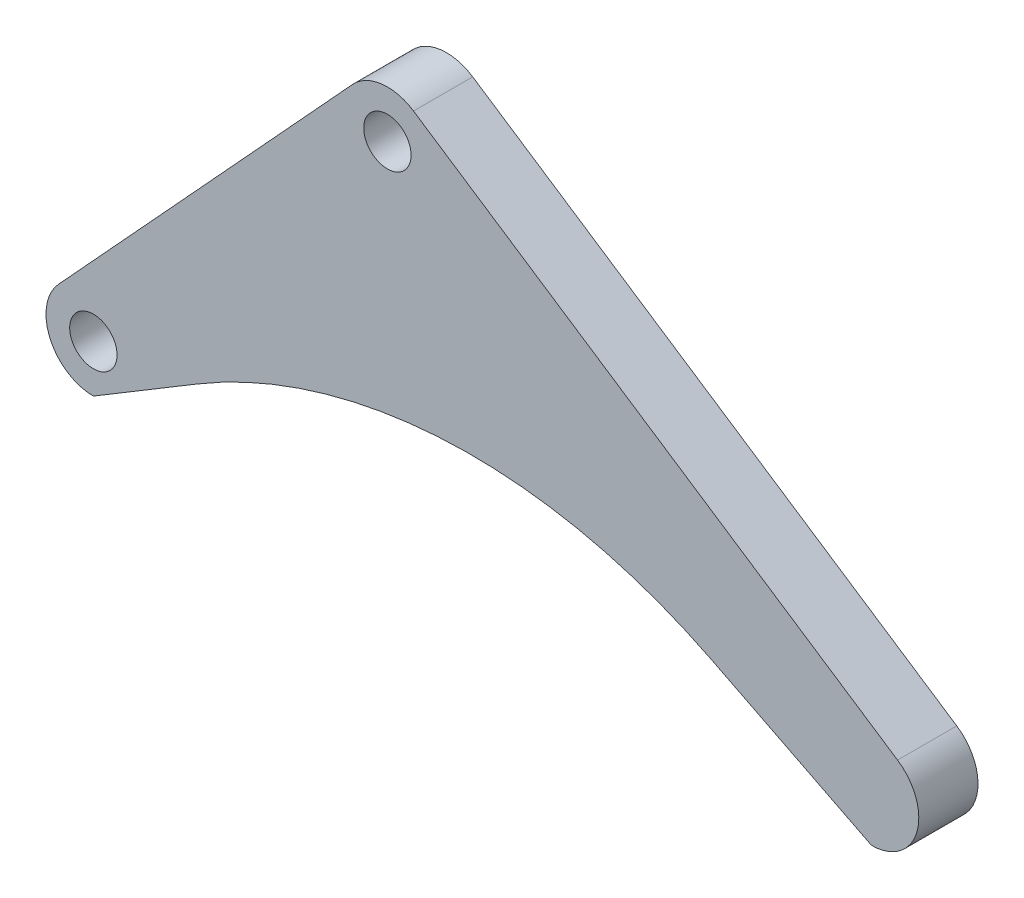
ISO-10303-21;
HEADER;
FILE_DESCRIPTION(('STEP AP214'),'2;1');
FILE_NAME('part.step','',(''),(''),'','','');
FILE_SCHEMA(('AUTOMOTIVE_DESIGN { 1 0 10303 214 1 1 1 1 }'));
ENDSEC;
DATA;
#1=APPLICATION_CONTEXT('core data for automotive mechanical design processes');
#2=APPLICATION_PROTOCOL_DEFINITION('international standard','automotive_design',2000,#1);
#3=PRODUCT_CONTEXT('',#1,'mechanical');
#4=PRODUCT('Part','Part','',(#3));
#5=PRODUCT_RELATED_PRODUCT_CATEGORY('part','',(#4));
#6=PRODUCT_DEFINITION_FORMATION('','',#4);
#7=PRODUCT_DEFINITION_CONTEXT('part definition',#1,'design');
#8=PRODUCT_DEFINITION('design','',#6,#7);
#9=PRODUCT_DEFINITION_SHAPE('','',#8);
#10=(LENGTH_UNIT() NAMED_UNIT(*) SI_UNIT(.MILLI.,.METRE.));
#11=(NAMED_UNIT(*) PLANE_ANGLE_UNIT() SI_UNIT($,.RADIAN.));
#12=(NAMED_UNIT(*) SI_UNIT($,.STERADIAN.) SOLID_ANGLE_UNIT());
#13=UNCERTAINTY_MEASURE_WITH_UNIT(LENGTH_MEASURE(1.E-05),#10,'distance_accuracy_value','');
#14=(GEOMETRIC_REPRESENTATION_CONTEXT(3) GLOBAL_UNCERTAINTY_ASSIGNED_CONTEXT((#13)) GLOBAL_UNIT_ASSIGNED_CONTEXT((#10,
#11,#12)) REPRESENTATION_CONTEXT('',''));
#15=CARTESIAN_POINT('',(0.,0.,0.));
#16=DIRECTION('',(0.,0.,1.));
#17=DIRECTION('',(1.,0.,0.));
#18=AXIS2_PLACEMENT_3D('',#15,#16,#17);
#19=CARTESIAN_POINT('',(65.7,0.,2.5));
#20=DIRECTION('',(0.,0.,1.));
#21=DIRECTION('',(1.,0.,0.));
#22=AXIS2_PLACEMENT_3D('',#19,#20,#21);
#23=PLANE('',#22);
#24=CARTESIAN_POINT('',(24.8278538812785,27.0271654386819,2.5));
#25=DIRECTION('',(0.,0.,1.));
#26=DIRECTION('',(1.,0.,0.));
#27=AXIS2_PLACEMENT_3D('',#24,#25,#26);
#28=CIRCLE('',#27,2.);
#29=CARTESIAN_POINT('',(26.8278538812785,27.0271654386819,2.5));
#30=VERTEX_POINT('',#29);
#31=EDGE_CURVE('E146',#30,#30,#28,.T.);
#32=ORIENTED_EDGE('',*,*,#31,.F.);
#33=EDGE_LOOP('',(#32));
#34=FACE_BOUND('',#33,.T.);
#35=CARTESIAN_POINT('',(65.7,0.,2.5));
#36=DIRECTION('',(0.,0.,1.));
#37=DIRECTION('',(1.,0.,0.));
#38=AXIS2_PLACEMENT_3D('',#35,#36,#37);
#39=CIRCLE('',#38,4.);
#40=CARTESIAN_POINT('',(65.6999999999998,-4.,2.5));
#41=VERTEX_POINT('',#40);
#42=CARTESIAN_POINT('',(67.9062992194841,3.33650172397736,2.5));
#43=VERTEX_POINT('',#42);
#44=EDGE_CURVE('E164',#41,#43,#39,.T.);
#45=ORIENTED_EDGE('',*,*,#44,.T.);
#46=DIRECTION('',(-0.834125430994315,0.551574804871059,0.));
#47=VECTOR('',#46,1.);
#48=CARTESIAN_POINT('',(27.0341531007628,30.3636671626592,2.5));
#49=LINE('',#48,#47);
#50=CARTESIAN_POINT('',(27.0341531007628,30.3636671626592,2.5));
#51=VERTEX_POINT('',#50);
#52=EDGE_CURVE('E100',#43,#51,#49,.T.);
#53=ORIENTED_EDGE('',*,*,#52,.T.);
#54=CARTESIAN_POINT('',(24.8278538812785,27.0271654386819,2.5));
#55=DIRECTION('',(0.,0.,1.));
#56=DIRECTION('',(-1.,0.,0.));
#57=AXIS2_PLACEMENT_3D('',#54,#55,#56);
#58=CIRCLE('',#57,4.);
#59=CARTESIAN_POINT('',(21.8821137789699,29.7331985592572,2.5));
#60=VERTEX_POINT('',#59);
#61=EDGE_CURVE('E185',#51,#60,#58,.T.);
#62=ORIENTED_EDGE('',*,*,#61,.T.);
#63=DIRECTION('',(-0.67650828014383,-0.736435025577164,0.));
#64=VECTOR('',#63,1.);
#65=CARTESIAN_POINT('',(-2.9457401023086,2.70603312057538,2.5));
#66=LINE('',#65,#64);
#67=CARTESIAN_POINT('',(-2.9457401023086,2.70603312057538,2.5));
#68=VERTEX_POINT('',#67);
#69=EDGE_CURVE('E199',#60,#68,#66,.T.);
#70=ORIENTED_EDGE('',*,*,#69,.T.);
#71=CARTESIAN_POINT('',(0.,0.,2.5));
#72=DIRECTION('',(0.,0.,1.));
#73=DIRECTION('',(-1.,0.,0.));
#74=AXIS2_PLACEMENT_3D('',#71,#72,#73);
#75=CIRCLE('',#74,4.);
#76=CARTESIAN_POINT('',(0.,-4.,2.5));
#77=VERTEX_POINT('',#76);
#78=EDGE_CURVE('E119',#68,#77,#75,.T.);
#79=ORIENTED_EDGE('',*,*,#78,.T.);
#80=DIRECTION('',(0.857031963470319,0.515263246884745,0.));
#81=VECTOR('',#80,1.);
#82=CARTESIAN_POINT('',(0.,-4.,2.5));
#83=LINE('',#82,#81);
#84=CARTESIAN_POINT('',(8.70031654707193,1.23078898343161,2.5));
#85=VERTEX_POINT('',#84);
#86=EDGE_CURVE('E113',#77,#85,#83,.T.);
#87=ORIENTED_EDGE('',*,*,#86,.T.);
#88=CARTESIAN_POINT('',(31.8871626568856,-37.3356493727326,2.5));
#89=DIRECTION('',(0.,0.,-1.));
#90=DIRECTION('',(1.,0.,0.));
#91=AXIS2_PLACEMENT_3D('',#88,#89,#90);
#92=CIRCLE('',#91,45.);
#93=CARTESIAN_POINT('',(52.1756530029727,2.8312170656234,2.5));
#94=VERTEX_POINT('',#93);
#95=EDGE_CURVE('E117',#85,#94,#92,.T.);
#96=ORIENTED_EDGE('',*,*,#95,.T.);
#97=DIRECTION('',(0.89259703196347,-0.450855341024152,0.));
#98=VECTOR('',#97,1.);
#99=CARTESIAN_POINT('',(52.1756530029727,2.8312170656234,2.5));
#100=LINE('',#99,#98);
#101=EDGE_CURVE('E57',#94,#41,#100,.T.);
#102=ORIENTED_EDGE('',*,*,#101,.T.);
#103=EDGE_LOOP('',(#45,#53,#62,#70,#79,#87,#96,#102));
#104=FACE_BOUND('',#103,.T.);
#105=CARTESIAN_POINT('',(0.,0.,2.5));
#106=DIRECTION('',(0.,0.,1.));
#107=DIRECTION('',(1.,0.,0.));
#108=AXIS2_PLACEMENT_3D('',#105,#106,#107);
#109=CIRCLE('',#108,2.);
#110=CARTESIAN_POINT('',(2.,0.,2.5));
#111=VERTEX_POINT('',#110);
#112=EDGE_CURVE('E213',#111,#111,#109,.T.);
#113=ORIENTED_EDGE('',*,*,#112,.F.);
#114=EDGE_LOOP('',(#113));
#115=FACE_BOUND('',#114,.T.);
#116=ADVANCED_FACE('F39',(#34,#104,#115),#23,.T.);
#117=CARTESIAN_POINT('',(65.7,0.,-2.5));
#118=DIRECTION('',(0.,0.,1.));
#119=DIRECTION('',(1.,0.,0.));
#120=AXIS2_PLACEMENT_3D('',#117,#118,#119);
#121=PLANE('',#120);
#122=CARTESIAN_POINT('',(65.7,0.,-2.5));
#123=DIRECTION('',(0.,0.,1.));
#124=DIRECTION('',(1.,0.,0.));
#125=AXIS2_PLACEMENT_3D('',#122,#123,#124);
#126=CIRCLE('',#125,4.);
#127=CARTESIAN_POINT('',(65.6999999999998,-4.,-2.5));
#128=VERTEX_POINT('',#127);
#129=CARTESIAN_POINT('',(67.9062992194841,3.33650172397736,-2.5));
#130=VERTEX_POINT('',#129);
#131=EDGE_CURVE('E141',#128,#130,#126,.T.);
#132=ORIENTED_EDGE('',*,*,#131,.F.);
#133=DIRECTION('',(0.89259703196347,-0.450855341024152,0.));
#134=VECTOR('',#133,1.);
#135=CARTESIAN_POINT('',(52.1756530029727,2.8312170656234,-2.5));
#136=LINE('',#135,#134);
#137=CARTESIAN_POINT('',(52.1756530029727,2.8312170656234,-2.5));
#138=VERTEX_POINT('',#137);
#139=EDGE_CURVE('E92',#138,#128,#136,.T.);
#140=ORIENTED_EDGE('',*,*,#139,.F.);
#141=CARTESIAN_POINT('',(31.8871626568856,-37.3356493727326,-2.5));
#142=DIRECTION('',(0.,0.,-1.));
#143=DIRECTION('',(1.,0.,0.));
#144=AXIS2_PLACEMENT_3D('',#141,#142,#143);
#145=CIRCLE('',#144,45.);
#146=CARTESIAN_POINT('',(8.70031654707193,1.23078898343161,-2.5));
#147=VERTEX_POINT('',#146);
#148=EDGE_CURVE('E86',#147,#138,#145,.T.);
#149=ORIENTED_EDGE('',*,*,#148,.F.);
#150=DIRECTION('',(0.857031963470319,0.515263246884745,0.));
#151=VECTOR('',#150,1.);
#152=CARTESIAN_POINT('',(0.,-4.,-2.5));
#153=LINE('',#152,#151);
#154=CARTESIAN_POINT('',(0.,-4.,-2.5));
#155=VERTEX_POINT('',#154);
#156=EDGE_CURVE('E128',#155,#147,#153,.T.);
#157=ORIENTED_EDGE('',*,*,#156,.F.);
#158=CARTESIAN_POINT('',(0.,0.,-2.5));
#159=DIRECTION('',(0.,0.,1.));
#160=DIRECTION('',(-1.,0.,0.));
#161=AXIS2_PLACEMENT_3D('',#158,#159,#160);
#162=CIRCLE('',#161,4.);
#163=CARTESIAN_POINT('',(-2.9457401023086,2.70603312057538,-2.5));
#164=VERTEX_POINT('',#163);
#165=EDGE_CURVE('E155',#164,#155,#162,.T.);
#166=ORIENTED_EDGE('',*,*,#165,.F.);
#167=DIRECTION('',(-0.67650828014383,-0.736435025577164,0.));
#168=VECTOR('',#167,1.);
#169=CARTESIAN_POINT('',(-2.9457401023086,2.70603312057538,-2.5));
#170=LINE('',#169,#168);
#171=CARTESIAN_POINT('',(21.8821137789699,29.7331985592572,-2.5));
#172=VERTEX_POINT('',#171);
#173=EDGE_CURVE('E152',#172,#164,#170,.T.);
#174=ORIENTED_EDGE('',*,*,#173,.F.);
#175=CARTESIAN_POINT('',(24.8278538812785,27.0271654386819,-2.5));
#176=DIRECTION('',(0.,0.,1.));
#177=DIRECTION('',(-1.,0.,0.));
#178=AXIS2_PLACEMENT_3D('',#175,#176,#177);
#179=CIRCLE('',#178,4.);
#180=CARTESIAN_POINT('',(27.0341531007628,30.3636671626592,-2.5));
#181=VERTEX_POINT('',#180);
#182=EDGE_CURVE('E149',#181,#172,#179,.T.);
#183=ORIENTED_EDGE('',*,*,#182,.F.);
#184=DIRECTION('',(-0.834125430994315,0.551574804871059,0.));
#185=VECTOR('',#184,1.);
#186=CARTESIAN_POINT('',(27.0341531007628,30.3636671626592,-2.5));
#187=LINE('',#186,#185);
#188=EDGE_CURVE('E145',#130,#181,#187,.T.);
#189=ORIENTED_EDGE('',*,*,#188,.F.);
#190=EDGE_LOOP('',(#132,#140,#149,#157,#166,#174,#183,#189));
#191=FACE_BOUND('',#190,.T.);
#192=CARTESIAN_POINT('',(24.8278538812785,27.0271654386819,-2.5));
#193=DIRECTION('',(0.,0.,1.));
#194=DIRECTION('',(1.,0.,0.));
#195=AXIS2_PLACEMENT_3D('',#192,#193,#194);
#196=CIRCLE('',#195,2.);
#197=CARTESIAN_POINT('',(26.8278538812785,27.0271654386819,-2.5));
#198=VERTEX_POINT('',#197);
#199=EDGE_CURVE('E209',#198,#198,#196,.T.);
#200=ORIENTED_EDGE('',*,*,#199,.T.);
#201=EDGE_LOOP('',(#200));
#202=FACE_BOUND('',#201,.T.);
#203=CARTESIAN_POINT('',(0.,0.,-2.5));
#204=DIRECTION('',(0.,0.,1.));
#205=DIRECTION('',(1.,0.,0.));
#206=AXIS2_PLACEMENT_3D('',#203,#204,#205);
#207=CIRCLE('',#206,2.);
#208=CARTESIAN_POINT('',(2.,0.,-2.5));
#209=VERTEX_POINT('',#208);
#210=EDGE_CURVE('E217',#209,#209,#207,.T.);
#211=ORIENTED_EDGE('',*,*,#210,.T.);
#212=EDGE_LOOP('',(#211));
#213=FACE_BOUND('',#212,.T.);
#214=ADVANCED_FACE('F189',(#191,#202,#213),#121,.F.);
#215=CARTESIAN_POINT('',(65.7,0.,2.5));
#216=DIRECTION('',(0.,0.,-1.));
#217=DIRECTION('',(-1.,0.,0.));
#218=AXIS2_PLACEMENT_3D('',#215,#216,#217);
#219=CYLINDRICAL_SURFACE('',#218,4.);
#220=ORIENTED_EDGE('',*,*,#131,.T.);
#221=DIRECTION('',(0.,0.,-1.));
#222=VECTOR('',#221,1.);
#223=CARTESIAN_POINT('',(67.9062992194841,3.33650172397736,2.5));
#224=LINE('',#223,#222);
#225=EDGE_CURVE('E11',#43,#130,#224,.T.);
#226=ORIENTED_EDGE('',*,*,#225,.F.);
#227=ORIENTED_EDGE('',*,*,#44,.F.);
#228=DIRECTION('',(0.,0.,-1.));
#229=VECTOR('',#228,1.);
#230=CARTESIAN_POINT('',(65.6999999999998,-4.,2.5));
#231=LINE('',#230,#229);
#232=EDGE_CURVE('E137',#41,#128,#231,.T.);
#233=ORIENTED_EDGE('',*,*,#232,.T.);
#234=EDGE_LOOP('',(#220,#226,#227,#233));
#235=FACE_BOUND('',#234,.T.);
#236=ADVANCED_FACE('F41',(#235),#219,.T.);
#237=CARTESIAN_POINT('',(27.0341531007628,30.3636671626592,2.5));
#238=DIRECTION('',(-0.551574804871059,-0.834125430994316,0.));
#239=DIRECTION('',(0.834125430994316,-0.551574804871059,0.));
#240=AXIS2_PLACEMENT_3D('',#237,#238,#239);
#241=PLANE('',#240);
#242=ORIENTED_EDGE('',*,*,#188,.T.);
#243=DIRECTION('',(0.,0.,-1.));
#244=VECTOR('',#243,1.);
#245=CARTESIAN_POINT('',(27.0341531007628,30.3636671626592,2.5));
#246=LINE('',#245,#244);
#247=EDGE_CURVE('E49',#51,#181,#246,.T.);
#248=ORIENTED_EDGE('',*,*,#247,.F.);
#249=ORIENTED_EDGE('',*,*,#52,.F.);
#250=ORIENTED_EDGE('',*,*,#225,.T.);
#251=EDGE_LOOP('',(#242,#248,#249,#250));
#252=FACE_BOUND('',#251,.T.);
#253=ADVANCED_FACE('F251',(#252),#241,.F.);
#254=CARTESIAN_POINT('',(24.8278538812785,27.0271654386819,2.5));
#255=DIRECTION('',(0.,0.,-1.));
#256=DIRECTION('',(-1.,0.,0.));
#257=AXIS2_PLACEMENT_3D('',#254,#255,#256);
#258=CYLINDRICAL_SURFACE('',#257,4.);
#259=ORIENTED_EDGE('',*,*,#182,.T.);
#260=DIRECTION('',(0.,0.,-1.));
#261=VECTOR('',#260,1.);
#262=CARTESIAN_POINT('',(21.8821137789699,29.7331985592572,2.5));
#263=LINE('',#262,#261);
#264=EDGE_CURVE('E175',#60,#172,#263,.T.);
#265=ORIENTED_EDGE('',*,*,#264,.F.);
#266=ORIENTED_EDGE('',*,*,#61,.F.);
#267=ORIENTED_EDGE('',*,*,#247,.T.);
#268=EDGE_LOOP('',(#259,#265,#266,#267));
#269=FACE_BOUND('',#268,.T.);
#270=ADVANCED_FACE('F183',(#269),#258,.T.);
#271=CARTESIAN_POINT('',(-2.9457401023086,2.70603312057538,2.5));
#272=DIRECTION('',(0.736435025577164,-0.67650828014383,0.));
#273=DIRECTION('',(0.67650828014383,0.736435025577164,0.));
#274=AXIS2_PLACEMENT_3D('',#271,#272,#273);
#275=PLANE('',#274);
#276=ORIENTED_EDGE('',*,*,#173,.T.);
#277=DIRECTION('',(0.,0.,-1.));
#278=VECTOR('',#277,1.);
#279=CARTESIAN_POINT('',(-2.9457401023086,2.70603312057538,2.5));
#280=LINE('',#279,#278);
#281=EDGE_CURVE('E171',#68,#164,#280,.T.);
#282=ORIENTED_EDGE('',*,*,#281,.F.);
#283=ORIENTED_EDGE('',*,*,#69,.F.);
#284=ORIENTED_EDGE('',*,*,#264,.T.);
#285=EDGE_LOOP('',(#276,#282,#283,#284));
#286=FACE_BOUND('',#285,.T.);
#287=ADVANCED_FACE('F194',(#286),#275,.F.);
#288=CARTESIAN_POINT('',(0.,0.,2.5));
#289=DIRECTION('',(0.,0.,-1.));
#290=DIRECTION('',(-1.,0.,0.));
#291=AXIS2_PLACEMENT_3D('',#288,#289,#290);
#292=CYLINDRICAL_SURFACE('',#291,4.);
#293=ORIENTED_EDGE('',*,*,#165,.T.);
#294=DIRECTION('',(0.,0.,-1.));
#295=VECTOR('',#294,1.);
#296=CARTESIAN_POINT('',(0.,-4.,2.5));
#297=LINE('',#296,#295);
#298=EDGE_CURVE('E130',#77,#155,#297,.T.);
#299=ORIENTED_EDGE('',*,*,#298,.F.);
#300=ORIENTED_EDGE('',*,*,#78,.F.);
#301=ORIENTED_EDGE('',*,*,#281,.T.);
#302=EDGE_LOOP('',(#293,#299,#300,#301));
#303=FACE_BOUND('',#302,.T.);
#304=ADVANCED_FACE('F197',(#303),#292,.T.);
#305=CARTESIAN_POINT('',(0.,-4.,2.5));
#306=DIRECTION('',(-0.515263246884745,0.857031963470319,0.));
#307=DIRECTION('',(-0.857031963470319,-0.515263246884745,0.));
#308=AXIS2_PLACEMENT_3D('',#305,#306,#307);
#309=PLANE('',#308);
#310=ORIENTED_EDGE('',*,*,#156,.T.);
#311=DIRECTION('',(0.,0.,-1.));
#312=VECTOR('',#311,1.);
#313=CARTESIAN_POINT('',(8.70031654707193,1.23078898343161,2.5));
#314=LINE('',#313,#312);
#315=EDGE_CURVE('E125',#85,#147,#314,.T.);
#316=ORIENTED_EDGE('',*,*,#315,.F.);
#317=ORIENTED_EDGE('',*,*,#86,.F.);
#318=ORIENTED_EDGE('',*,*,#298,.T.);
#319=EDGE_LOOP('',(#310,#316,#317,#318));
#320=FACE_BOUND('',#319,.T.);
#321=ADVANCED_FACE('F126',(#320),#309,.F.);
#322=CARTESIAN_POINT('',(31.8871626568856,-37.3356493727326,2.5));
#323=DIRECTION('',(0.,0.,-1.));
#324=DIRECTION('',(-1.,0.,0.));
#325=AXIS2_PLACEMENT_3D('',#322,#323,#324);
#326=CYLINDRICAL_SURFACE('',#325,45.);
#327=ORIENTED_EDGE('',*,*,#148,.T.);
#328=DIRECTION('',(0.,0.,-1.));
#329=VECTOR('',#328,1.);
#330=CARTESIAN_POINT('',(52.1756530029727,2.8312170656234,2.5));
#331=LINE('',#330,#329);
#332=EDGE_CURVE('E131',#94,#138,#331,.T.);
#333=ORIENTED_EDGE('',*,*,#332,.F.);
#334=ORIENTED_EDGE('',*,*,#95,.F.);
#335=ORIENTED_EDGE('',*,*,#315,.T.);
#336=EDGE_LOOP('',(#327,#333,#334,#335));
#337=FACE_BOUND('',#336,.T.);
#338=ADVANCED_FACE('F133',(#337),#326,.F.);
#339=CARTESIAN_POINT('',(52.1756530029727,2.8312170656234,2.5));
#340=DIRECTION('',(0.450855341024152,0.89259703196347,0.));
#341=DIRECTION('',(-0.89259703196347,0.450855341024153,0.));
#342=AXIS2_PLACEMENT_3D('',#339,#340,#341);
#343=PLANE('',#342);
#344=ORIENTED_EDGE('',*,*,#139,.T.);
#345=ORIENTED_EDGE('',*,*,#232,.F.);
#346=ORIENTED_EDGE('',*,*,#101,.F.);
#347=ORIENTED_EDGE('',*,*,#332,.T.);
#348=EDGE_LOOP('',(#344,#345,#346,#347));
#349=FACE_BOUND('',#348,.T.);
#350=ADVANCED_FACE('F239',(#349),#343,.F.);
#351=CARTESIAN_POINT('',(24.8278538812785,27.0271654386819,2.5));
#352=DIRECTION('',(0.,0.,-1.));
#353=DIRECTION('',(-1.,0.,0.));
#354=AXIS2_PLACEMENT_3D('',#351,#352,#353);
#355=CYLINDRICAL_SURFACE('',#354,2.);
#356=ORIENTED_EDGE('',*,*,#31,.T.);
#357=EDGE_LOOP('',(#356));
#358=FACE_BOUND('',#357,.T.);
#359=ORIENTED_EDGE('',*,*,#199,.F.);
#360=EDGE_LOOP('',(#359));
#361=FACE_BOUND('',#360,.T.);
#362=ADVANCED_FACE('F236',(#358,#361),#355,.F.);
#363=CARTESIAN_POINT('',(0.,0.,2.5));
#364=DIRECTION('',(0.,0.,-1.));
#365=DIRECTION('',(-1.,0.,0.));
#366=AXIS2_PLACEMENT_3D('',#363,#364,#365);
#367=CYLINDRICAL_SURFACE('',#366,2.);
#368=ORIENTED_EDGE('',*,*,#112,.T.);
#369=EDGE_LOOP('',(#368));
#370=FACE_BOUND('',#369,.T.);
#371=ORIENTED_EDGE('',*,*,#210,.F.);
#372=EDGE_LOOP('',(#371));
#373=FACE_BOUND('',#372,.T.);
#374=ADVANCED_FACE('F225',(#370,#373),#367,.F.);
#375=CLOSED_SHELL('',(#116,#214,#236,#253,#270,#287,#304,#321,#338,#350,#362,#374));
#376=MANIFOLD_SOLID_BREP('B2',#375);
#377=ADVANCED_BREP_SHAPE_REPRESENTATION('',(#18,#376),#14);
#378=SHAPE_DEFINITION_REPRESENTATION(#9,#377);
ENDSEC;
END-ISO-10303-21;
